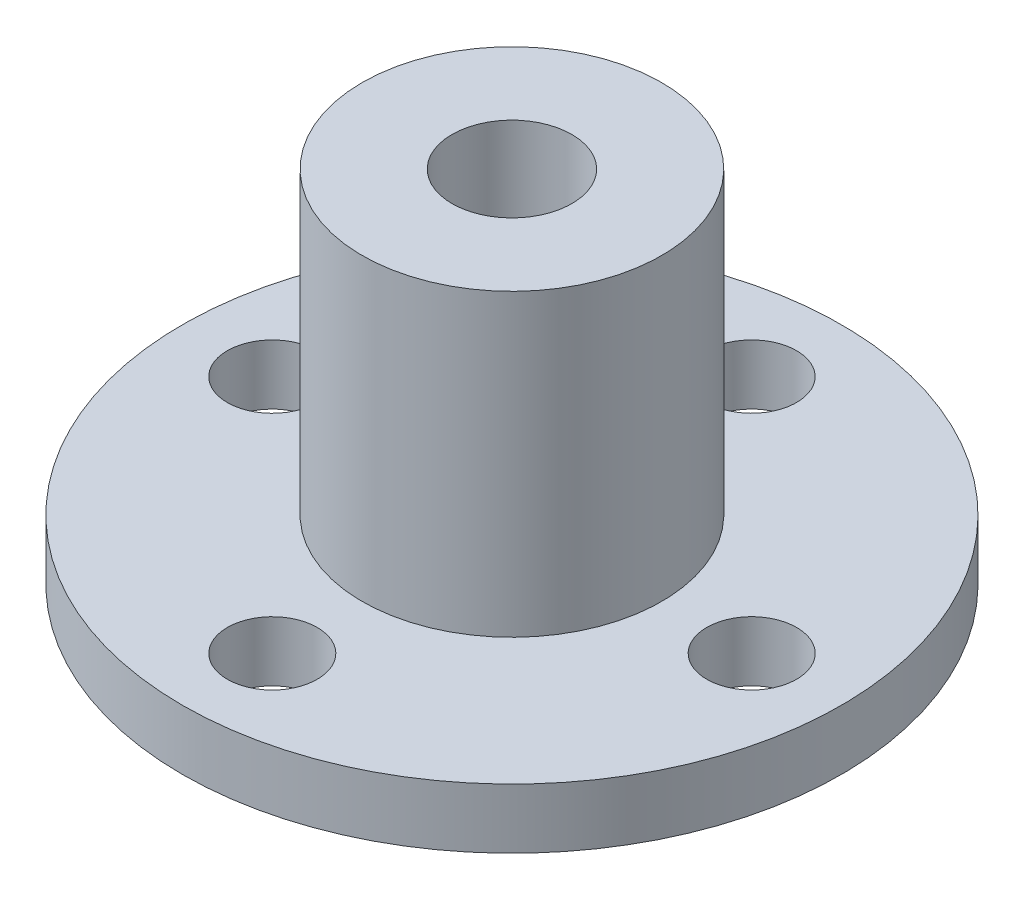
ISO-10303-21;
HEADER;
FILE_DESCRIPTION(('STEP AP214'),'2;1');
FILE_NAME('part.step','',(''),(''),'','','');
FILE_SCHEMA(('AUTOMOTIVE_DESIGN { 1 0 10303 214 1 1 1 1 }'));
ENDSEC;
DATA;
#1=APPLICATION_CONTEXT('core data for automotive mechanical design processes');
#2=APPLICATION_PROTOCOL_DEFINITION('international standard','automotive_design',2000,#1);
#3=PRODUCT_CONTEXT('',#1,'mechanical');
#4=PRODUCT('Part','Part','',(#3));
#5=PRODUCT_RELATED_PRODUCT_CATEGORY('part','',(#4));
#6=PRODUCT_DEFINITION_FORMATION('','',#4);
#7=PRODUCT_DEFINITION_CONTEXT('part definition',#1,'design');
#8=PRODUCT_DEFINITION('design','',#6,#7);
#9=PRODUCT_DEFINITION_SHAPE('','',#8);
#10=(LENGTH_UNIT() NAMED_UNIT(*) SI_UNIT(.MILLI.,.METRE.));
#11=(NAMED_UNIT(*) PLANE_ANGLE_UNIT() SI_UNIT($,.RADIAN.));
#12=(NAMED_UNIT(*) SI_UNIT($,.STERADIAN.) SOLID_ANGLE_UNIT());
#13=UNCERTAINTY_MEASURE_WITH_UNIT(LENGTH_MEASURE(1.E-05),#10,'distance_accuracy_value','');
#14=(GEOMETRIC_REPRESENTATION_CONTEXT(3) GLOBAL_UNCERTAINTY_ASSIGNED_CONTEXT((#13)) GLOBAL_UNIT_ASSIGNED_CONTEXT((#10,
#11,#12)) REPRESENTATION_CONTEXT('',''));
#15=CARTESIAN_POINT('',(0.,0.,0.));
#16=DIRECTION('',(0.,0.,1.));
#17=DIRECTION('',(1.,0.,0.));
#18=AXIS2_PLACEMENT_3D('',#15,#16,#17);
#19=CARTESIAN_POINT('',(0.,2.,0.));
#20=DIRECTION('',(0.,-1.,0.));
#21=DIRECTION('',(0.,0.,-1.));
#22=AXIS2_PLACEMENT_3D('',#19,#20,#21);
#23=CYLINDRICAL_SURFACE('',#22,11.);
#24=CARTESIAN_POINT('',(0.,2.,0.));
#25=DIRECTION('',(0.,1.,0.));
#26=DIRECTION('',(0.,0.,1.));
#27=AXIS2_PLACEMENT_3D('',#24,#25,#26);
#28=CIRCLE('',#27,11.);
#29=CARTESIAN_POINT('',(0.,2.,11.));
#30=VERTEX_POINT('',#29);
#31=EDGE_CURVE('E44',#30,#30,#28,.T.);
#32=ORIENTED_EDGE('',*,*,#31,.F.);
#33=EDGE_LOOP('',(#32));
#34=FACE_BOUND('',#33,.T.);
#35=CARTESIAN_POINT('',(0.,0.,0.));
#36=DIRECTION('',(0.,1.,0.));
#37=DIRECTION('',(0.,0.,1.));
#38=AXIS2_PLACEMENT_3D('',#35,#36,#37);
#39=CIRCLE('',#38,11.);
#40=CARTESIAN_POINT('',(0.,0.,11.));
#41=VERTEX_POINT('',#40);
#42=EDGE_CURVE('E49',#41,#41,#39,.T.);
#43=ORIENTED_EDGE('',*,*,#42,.T.);
#44=EDGE_LOOP('',(#43));
#45=FACE_BOUND('',#44,.T.);
#46=ADVANCED_FACE('F37',(#34,#45),#23,.T.);
#47=CARTESIAN_POINT('',(0.,2.,0.));
#48=DIRECTION('',(0.,1.,0.));
#49=DIRECTION('',(0.,0.,1.));
#50=AXIS2_PLACEMENT_3D('',#47,#48,#49);
#51=PLANE('',#50);
#52=CARTESIAN_POINT('',(-8.,2.,0.));
#53=DIRECTION('',(0.,1.,0.));
#54=DIRECTION('',(-1.,0.,0.));
#55=AXIS2_PLACEMENT_3D('',#52,#53,#54);
#56=CIRCLE('',#55,1.5);
#57=CARTESIAN_POINT('',(-9.5,2.,0.));
#58=VERTEX_POINT('',#57);
#59=EDGE_CURVE('E61',#58,#58,#56,.T.);
#60=ORIENTED_EDGE('',*,*,#59,.F.);
#61=EDGE_LOOP('',(#60));
#62=FACE_BOUND('',#61,.T.);
#63=CARTESIAN_POINT('',(-0.000999999999972068,2.,-8.001));
#64=DIRECTION('',(0.,1.,0.));
#65=DIRECTION('',(-1.,0.,0.));
#66=AXIS2_PLACEMENT_3D('',#63,#64,#65);
#67=CIRCLE('',#66,1.5);
#68=CARTESIAN_POINT('',(-1.50099999999997,2.,-8.001));
#69=VERTEX_POINT('',#68);
#70=EDGE_CURVE('E108',#69,#69,#67,.T.);
#71=ORIENTED_EDGE('',*,*,#70,.F.);
#72=EDGE_LOOP('',(#71));
#73=FACE_BOUND('',#72,.T.);
#74=CARTESIAN_POINT('',(8.,2.,-0.00199999999994414));
#75=DIRECTION('',(0.,1.,0.));
#76=DIRECTION('',(-1.,0.,0.));
#77=AXIS2_PLACEMENT_3D('',#74,#75,#76);
#78=CIRCLE('',#77,1.5);
#79=CARTESIAN_POINT('',(6.5,2.,-0.00199999999994414));
#80=VERTEX_POINT('',#79);
#81=EDGE_CURVE('E112',#80,#80,#78,.T.);
#82=ORIENTED_EDGE('',*,*,#81,.F.);
#83=EDGE_LOOP('',(#82));
#84=FACE_BOUND('',#83,.T.);
#85=CARTESIAN_POINT('',(0.000999999999916204,2.,7.999));
#86=DIRECTION('',(0.,1.,0.));
#87=DIRECTION('',(-1.,0.,0.));
#88=AXIS2_PLACEMENT_3D('',#85,#86,#87);
#89=CIRCLE('',#88,1.5);
#90=CARTESIAN_POINT('',(-1.49900000000008,2.,7.999));
#91=VERTEX_POINT('',#90);
#92=EDGE_CURVE('E116',#91,#91,#89,.T.);
#93=ORIENTED_EDGE('',*,*,#92,.F.);
#94=EDGE_LOOP('',(#93));
#95=FACE_BOUND('',#94,.T.);
#96=CARTESIAN_POINT('',(0.,2.,0.));
#97=DIRECTION('',(0.,1.,0.));
#98=DIRECTION('',(-1.,0.,0.));
#99=AXIS2_PLACEMENT_3D('',#96,#97,#98);
#100=CIRCLE('',#99,5.);
#101=CARTESIAN_POINT('',(-5.,2.,0.));
#102=VERTEX_POINT('',#101);
#103=EDGE_CURVE('E10',#102,#102,#100,.T.);
#104=ORIENTED_EDGE('',*,*,#103,.F.);
#105=EDGE_LOOP('',(#104));
#106=FACE_BOUND('',#105,.T.);
#107=ORIENTED_EDGE('',*,*,#31,.T.);
#108=EDGE_LOOP('',(#107));
#109=FACE_BOUND('',#108,.T.);
#110=ADVANCED_FACE('F86',(#62,#73,#84,#95,#106,#109),#51,.T.);
#111=CARTESIAN_POINT('',(0.,0.,0.));
#112=DIRECTION('',(0.,1.,0.));
#113=DIRECTION('',(0.,0.,1.));
#114=AXIS2_PLACEMENT_3D('',#111,#112,#113);
#115=PLANE('',#114);
#116=CARTESIAN_POINT('',(0.,0.,0.));
#117=DIRECTION('',(0.,1.,0.));
#118=DIRECTION('',(-1.,0.,0.));
#119=AXIS2_PLACEMENT_3D('',#116,#117,#118);
#120=CIRCLE('',#119,2.);
#121=CARTESIAN_POINT('',(-2.,0.,0.));
#122=VERTEX_POINT('',#121);
#123=EDGE_CURVE('E118',#122,#122,#120,.T.);
#124=ORIENTED_EDGE('',*,*,#123,.T.);
#125=EDGE_LOOP('',(#124));
#126=FACE_BOUND('',#125,.T.);
#127=CARTESIAN_POINT('',(-8.,0.,0.));
#128=DIRECTION('',(0.,1.,0.));
#129=DIRECTION('',(0.,0.,1.));
#130=AXIS2_PLACEMENT_3D('',#127,#128,#129);
#131=CIRCLE('',#130,1.5);
#132=CARTESIAN_POINT('',(-8.,0.,1.5));
#133=VERTEX_POINT('',#132);
#134=EDGE_CURVE('E40',#133,#133,#131,.T.);
#135=ORIENTED_EDGE('',*,*,#134,.T.);
#136=EDGE_LOOP('',(#135));
#137=FACE_BOUND('',#136,.T.);
#138=CARTESIAN_POINT('',(-0.000999999999972191,0.,-8.001));
#139=DIRECTION('',(0.,1.,0.));
#140=DIRECTION('',(0.,0.,1.));
#141=AXIS2_PLACEMENT_3D('',#138,#139,#140);
#142=CIRCLE('',#141,1.5);
#143=CARTESIAN_POINT('',(-0.000999999999972191,0.,-6.501));
#144=VERTEX_POINT('',#143);
#145=EDGE_CURVE('E63',#144,#144,#142,.T.);
#146=ORIENTED_EDGE('',*,*,#145,.T.);
#147=EDGE_LOOP('',(#146));
#148=FACE_BOUND('',#147,.T.);
#149=CARTESIAN_POINT('',(8.,0.,-0.00199999999994414));
#150=DIRECTION('',(0.,1.,0.));
#151=DIRECTION('',(0.,0.,1.));
#152=AXIS2_PLACEMENT_3D('',#149,#150,#151);
#153=CIRCLE('',#152,1.5);
#154=CARTESIAN_POINT('',(8.,0.,1.49800000000006));
#155=VERTEX_POINT('',#154);
#156=EDGE_CURVE('E60',#155,#155,#153,.T.);
#157=ORIENTED_EDGE('',*,*,#156,.T.);
#158=EDGE_LOOP('',(#157));
#159=FACE_BOUND('',#158,.T.);
#160=CARTESIAN_POINT('',(0.000999999999916082,0.,7.999));
#161=DIRECTION('',(0.,1.,0.));
#162=DIRECTION('',(0.,0.,1.));
#163=AXIS2_PLACEMENT_3D('',#160,#161,#162);
#164=CIRCLE('',#163,1.5);
#165=CARTESIAN_POINT('',(0.000999999999916082,0.,9.499));
#166=VERTEX_POINT('',#165);
#167=EDGE_CURVE('E57',#166,#166,#164,.T.);
#168=ORIENTED_EDGE('',*,*,#167,.T.);
#169=EDGE_LOOP('',(#168));
#170=FACE_BOUND('',#169,.T.);
#171=ORIENTED_EDGE('',*,*,#42,.F.);
#172=EDGE_LOOP('',(#171));
#173=FACE_BOUND('',#172,.T.);
#174=ADVANCED_FACE('F77',(#126,#137,#148,#159,#170,#173),#115,.F.);
#175=CARTESIAN_POINT('',(0.,12.,0.));
#176=DIRECTION('',(0.,-1.,0.));
#177=DIRECTION('',(1.,0.,0.));
#178=AXIS2_PLACEMENT_3D('',#175,#176,#177);
#179=CYLINDRICAL_SURFACE('',#178,5.);
#180=CARTESIAN_POINT('',(0.,12.,0.));
#181=DIRECTION('',(0.,1.,0.));
#182=DIRECTION('',(-1.,0.,0.));
#183=AXIS2_PLACEMENT_3D('',#180,#181,#182);
#184=CIRCLE('',#183,5.);
#185=CARTESIAN_POINT('',(-5.,12.,0.));
#186=VERTEX_POINT('',#185);
#187=EDGE_CURVE('E52',#186,#186,#184,.T.);
#188=ORIENTED_EDGE('',*,*,#187,.F.);
#189=EDGE_LOOP('',(#188));
#190=FACE_BOUND('',#189,.T.);
#191=ORIENTED_EDGE('',*,*,#103,.T.);
#192=EDGE_LOOP('',(#191));
#193=FACE_BOUND('',#192,.T.);
#194=ADVANCED_FACE('F75',(#190,#193),#179,.T.);
#195=CARTESIAN_POINT('',(0.,12.,0.));
#196=DIRECTION('',(0.,1.,0.));
#197=DIRECTION('',(-1.,0.,0.));
#198=AXIS2_PLACEMENT_3D('',#195,#196,#197);
#199=PLANE('',#198);
#200=CARTESIAN_POINT('',(0.,12.,0.));
#201=DIRECTION('',(0.,1.,0.));
#202=DIRECTION('',(-1.,0.,0.));
#203=AXIS2_PLACEMENT_3D('',#200,#201,#202);
#204=CIRCLE('',#203,2.);
#205=CARTESIAN_POINT('',(-2.,12.,0.));
#206=VERTEX_POINT('',#205);
#207=EDGE_CURVE('E121',#206,#206,#204,.T.);
#208=ORIENTED_EDGE('',*,*,#207,.F.);
#209=EDGE_LOOP('',(#208));
#210=FACE_BOUND('',#209,.T.);
#211=ORIENTED_EDGE('',*,*,#187,.T.);
#212=EDGE_LOOP('',(#211));
#213=FACE_BOUND('',#212,.T.);
#214=ADVANCED_FACE('F73',(#210,#213),#199,.T.);
#215=CARTESIAN_POINT('',(0.000999999999915592,-8.,7.999));
#216=DIRECTION('',(0.,1.,0.));
#217=DIRECTION('',(-1.,0.,0.));
#218=AXIS2_PLACEMENT_3D('',#215,#216,#217);
#219=CYLINDRICAL_SURFACE('',#218,1.5);
#220=ORIENTED_EDGE('',*,*,#92,.T.);
#221=EDGE_LOOP('',(#220));
#222=FACE_BOUND('',#221,.T.);
#223=ORIENTED_EDGE('',*,*,#167,.F.);
#224=EDGE_LOOP('',(#223));
#225=FACE_BOUND('',#224,.T.);
#226=ADVANCED_FACE('F83',(#222,#225),#219,.F.);
#227=CARTESIAN_POINT('',(8.,-8.,-0.00199999999994414));
#228=DIRECTION('',(0.,1.,0.));
#229=DIRECTION('',(-1.,0.,0.));
#230=AXIS2_PLACEMENT_3D('',#227,#228,#229);
#231=CYLINDRICAL_SURFACE('',#230,1.5);
#232=ORIENTED_EDGE('',*,*,#81,.T.);
#233=EDGE_LOOP('',(#232));
#234=FACE_BOUND('',#233,.T.);
#235=ORIENTED_EDGE('',*,*,#156,.F.);
#236=EDGE_LOOP('',(#235));
#237=FACE_BOUND('',#236,.T.);
#238=ADVANCED_FACE('F144',(#234,#237),#231,.F.);
#239=CARTESIAN_POINT('',(-0.000999999999972681,-8.,-8.001));
#240=DIRECTION('',(0.,1.,0.));
#241=DIRECTION('',(-1.,0.,0.));
#242=AXIS2_PLACEMENT_3D('',#239,#240,#241);
#243=CYLINDRICAL_SURFACE('',#242,1.5);
#244=ORIENTED_EDGE('',*,*,#70,.T.);
#245=EDGE_LOOP('',(#244));
#246=FACE_BOUND('',#245,.T.);
#247=ORIENTED_EDGE('',*,*,#145,.F.);
#248=EDGE_LOOP('',(#247));
#249=FACE_BOUND('',#248,.T.);
#250=ADVANCED_FACE('F137',(#246,#249),#243,.F.);
#251=CARTESIAN_POINT('',(-8.,-8.,0.));
#252=DIRECTION('',(0.,1.,0.));
#253=DIRECTION('',(-1.,0.,0.));
#254=AXIS2_PLACEMENT_3D('',#251,#252,#253);
#255=CYLINDRICAL_SURFACE('',#254,1.5);
#256=ORIENTED_EDGE('',*,*,#59,.T.);
#257=EDGE_LOOP('',(#256));
#258=FACE_BOUND('',#257,.T.);
#259=ORIENTED_EDGE('',*,*,#134,.F.);
#260=EDGE_LOOP('',(#259));
#261=FACE_BOUND('',#260,.T.);
#262=ADVANCED_FACE('F131',(#258,#261),#255,.F.);
#263=CARTESIAN_POINT('',(0.,0.,0.));
#264=DIRECTION('',(0.,1.,0.));
#265=DIRECTION('',(-1.,0.,0.));
#266=AXIS2_PLACEMENT_3D('',#263,#264,#265);
#267=CYLINDRICAL_SURFACE('',#266,2.);
#268=ORIENTED_EDGE('',*,*,#123,.F.);
#269=EDGE_LOOP('',(#268));
#270=FACE_BOUND('',#269,.T.);
#271=ORIENTED_EDGE('',*,*,#207,.T.);
#272=EDGE_LOOP('',(#271));
#273=FACE_BOUND('',#272,.T.);
#274=ADVANCED_FACE('F129',(#270,#273),#267,.F.);
#275=CLOSED_SHELL('',(#46,#110,#174,#194,#214,#226,#238,#250,#262,#274));
#276=MANIFOLD_SOLID_BREP('B2',#275);
#277=ADVANCED_BREP_SHAPE_REPRESENTATION('',(#18,#276),#14);
#278=SHAPE_DEFINITION_REPRESENTATION(#9,#277);
ENDSEC;
END-ISO-10303-21;
